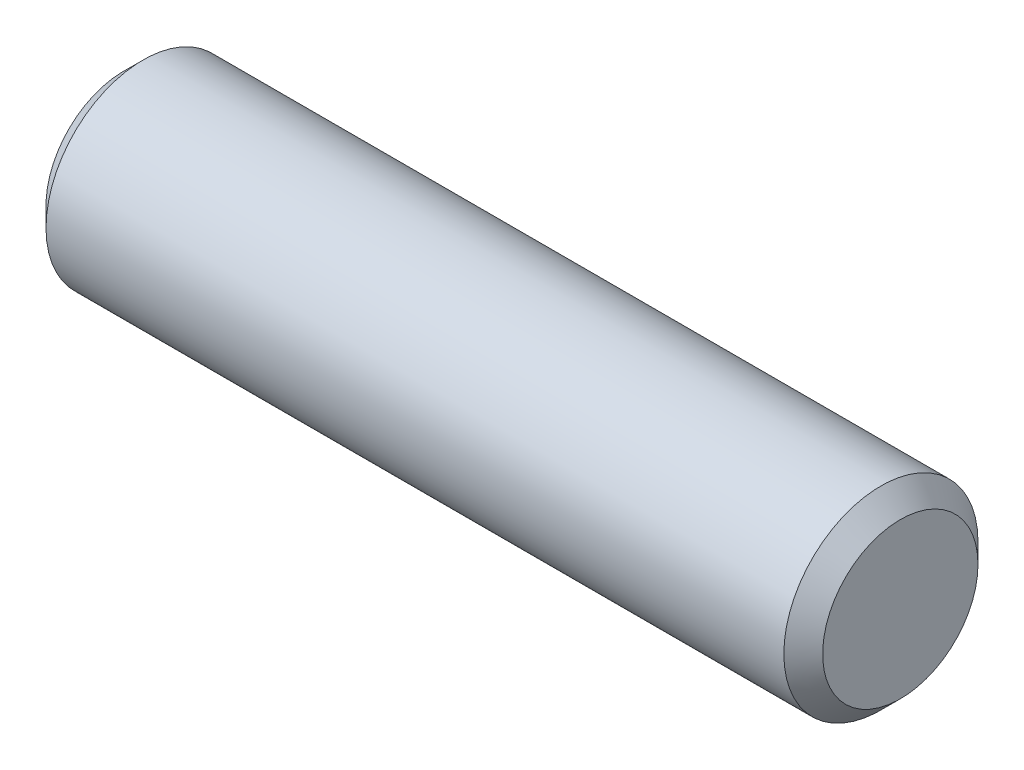
ISO-10303-21;
HEADER;
FILE_DESCRIPTION(('STEP AP214'),'2;1');
FILE_NAME('part.step','',(''),(''),'','','');
FILE_SCHEMA(('AUTOMOTIVE_DESIGN { 1 0 10303 214 1 1 1 1 }'));
ENDSEC;
DATA;
#1=APPLICATION_CONTEXT('core data for automotive mechanical design processes');
#2=APPLICATION_PROTOCOL_DEFINITION('international standard','automotive_design',2000,#1);
#3=PRODUCT_CONTEXT('',#1,'mechanical');
#4=PRODUCT('Part','Part','',(#3));
#5=PRODUCT_RELATED_PRODUCT_CATEGORY('part','',(#4));
#6=PRODUCT_DEFINITION_FORMATION('','',#4);
#7=PRODUCT_DEFINITION_CONTEXT('part definition',#1,'design');
#8=PRODUCT_DEFINITION('design','',#6,#7);
#9=PRODUCT_DEFINITION_SHAPE('','',#8);
#10=(LENGTH_UNIT() NAMED_UNIT(*) SI_UNIT(.MILLI.,.METRE.));
#11=(NAMED_UNIT(*) PLANE_ANGLE_UNIT() SI_UNIT($,.RADIAN.));
#12=(NAMED_UNIT(*) SI_UNIT($,.STERADIAN.) SOLID_ANGLE_UNIT());
#13=UNCERTAINTY_MEASURE_WITH_UNIT(LENGTH_MEASURE(1.E-05),#10,'distance_accuracy_value','');
#14=(GEOMETRIC_REPRESENTATION_CONTEXT(3) GLOBAL_UNCERTAINTY_ASSIGNED_CONTEXT((#13)) GLOBAL_UNIT_ASSIGNED_CONTEXT((#10,
#11,#12)) REPRESENTATION_CONTEXT('',''));
#15=CARTESIAN_POINT('',(0.,0.,0.));
#16=DIRECTION('',(0.,0.,1.));
#17=DIRECTION('',(1.,0.,0.));
#18=AXIS2_PLACEMENT_3D('',#15,#16,#17);
#19=CARTESIAN_POINT('',(-50.8,0.,0.));
#20=DIRECTION('',(1.,0.,0.));
#21=DIRECTION('',(0.,0.,-1.));
#22=AXIS2_PLACEMENT_3D('',#19,#20,#21);
#23=CYLINDRICAL_SURFACE('',#22,12.7);
#24=CARTESIAN_POINT('',(48.26,0.,0.));
#25=DIRECTION('',(1.,0.,0.));
#26=DIRECTION('',(0.,0.,-1.));
#27=AXIS2_PLACEMENT_3D('',#24,#25,#26);
#28=CIRCLE('',#27,12.7);
#29=CARTESIAN_POINT('',(48.26,0.,-12.7));
#30=VERTEX_POINT('',#29);
#31=EDGE_CURVE('E52',#30,#30,#28,.F.);
#32=ORIENTED_EDGE('',*,*,#31,.T.);
#33=EDGE_LOOP('',(#32));
#34=FACE_BOUND('',#33,.T.);
#35=CARTESIAN_POINT('',(-48.26,0.,0.));
#36=DIRECTION('',(1.,0.,0.));
#37=DIRECTION('',(0.,0.,-1.));
#38=AXIS2_PLACEMENT_3D('',#35,#36,#37);
#39=CIRCLE('',#38,12.7);
#40=CARTESIAN_POINT('',(-48.26,0.,-12.7));
#41=VERTEX_POINT('',#40);
#42=EDGE_CURVE('E56',#41,#41,#39,.T.);
#43=ORIENTED_EDGE('',*,*,#42,.T.);
#44=EDGE_LOOP('',(#43));
#45=FACE_BOUND('',#44,.T.);
#46=ADVANCED_FACE('F45',(#34,#45),#23,.T.);
#47=CARTESIAN_POINT('',(-50.8,0.,0.));
#48=DIRECTION('',(1.,0.,0.));
#49=DIRECTION('',(0.,0.,-1.));
#50=AXIS2_PLACEMENT_3D('',#47,#48,#49);
#51=PLANE('',#50);
#52=CARTESIAN_POINT('',(-50.8,0.,0.));
#53=DIRECTION('',(1.,0.,0.));
#54=DIRECTION('',(0.,0.,-1.));
#55=AXIS2_PLACEMENT_3D('',#52,#53,#54);
#56=CIRCLE('',#55,10.16);
#57=CARTESIAN_POINT('',(-50.8,0.,-10.16));
#58=VERTEX_POINT('',#57);
#59=EDGE_CURVE('E12',#58,#58,#56,.F.);
#60=ORIENTED_EDGE('',*,*,#59,.T.);
#61=EDGE_LOOP('',(#60));
#62=FACE_BOUND('',#61,.T.);
#63=ADVANCED_FACE('F76',(#62),#51,.F.);
#64=CARTESIAN_POINT('',(50.8,0.,0.));
#65=DIRECTION('',(1.,0.,0.));
#66=DIRECTION('',(0.,0.,-1.));
#67=AXIS2_PLACEMENT_3D('',#64,#65,#66);
#68=PLANE('',#67);
#69=CARTESIAN_POINT('',(50.8,0.,0.));
#70=DIRECTION('',(1.,0.,0.));
#71=DIRECTION('',(0.,0.,-1.));
#72=AXIS2_PLACEMENT_3D('',#69,#70,#71);
#73=CIRCLE('',#72,10.16);
#74=CARTESIAN_POINT('',(50.8,0.,-10.16));
#75=VERTEX_POINT('',#74);
#76=EDGE_CURVE('E60',#75,#75,#73,.T.);
#77=ORIENTED_EDGE('',*,*,#76,.T.);
#78=EDGE_LOOP('',(#77));
#79=FACE_BOUND('',#78,.T.);
#80=ADVANCED_FACE('F66',(#79),#68,.T.);
#81=CARTESIAN_POINT('',(50.8,0.,0.));
#82=DIRECTION('',(-1.,0.,0.));
#83=DIRECTION('',(0.,0.,1.));
#84=AXIS2_PLACEMENT_3D('',#81,#82,#83);
#85=CONICAL_SURFACE('',#84,10.16,0.785398163397448);
#86=ORIENTED_EDGE('',*,*,#31,.F.);
#87=EDGE_LOOP('',(#86));
#88=FACE_BOUND('',#87,.T.);
#89=ORIENTED_EDGE('',*,*,#76,.F.);
#90=EDGE_LOOP('',(#89));
#91=FACE_BOUND('',#90,.T.);
#92=ADVANCED_FACE('F68',(#88,#91),#85,.T.);
#93=CARTESIAN_POINT('',(-48.26,0.,0.));
#94=DIRECTION('',(1.,0.,0.));
#95=DIRECTION('',(0.,0.,-1.));
#96=AXIS2_PLACEMENT_3D('',#93,#94,#95);
#97=CONICAL_SURFACE('',#96,12.7,0.78539816339745);
#98=ORIENTED_EDGE('',*,*,#59,.F.);
#99=EDGE_LOOP('',(#98));
#100=FACE_BOUND('',#99,.T.);
#101=ORIENTED_EDGE('',*,*,#42,.F.);
#102=EDGE_LOOP('',(#101));
#103=FACE_BOUND('',#102,.T.);
#104=ADVANCED_FACE('F47',(#100,#103),#97,.T.);
#105=CLOSED_SHELL('',(#46,#63,#80,#92,#104));
#106=MANIFOLD_SOLID_BREP('B2',#105);
#107=ADVANCED_BREP_SHAPE_REPRESENTATION('',(#18,#106),#14);
#108=SHAPE_DEFINITION_REPRESENTATION(#9,#107);
ENDSEC;
END-ISO-10303-21;
